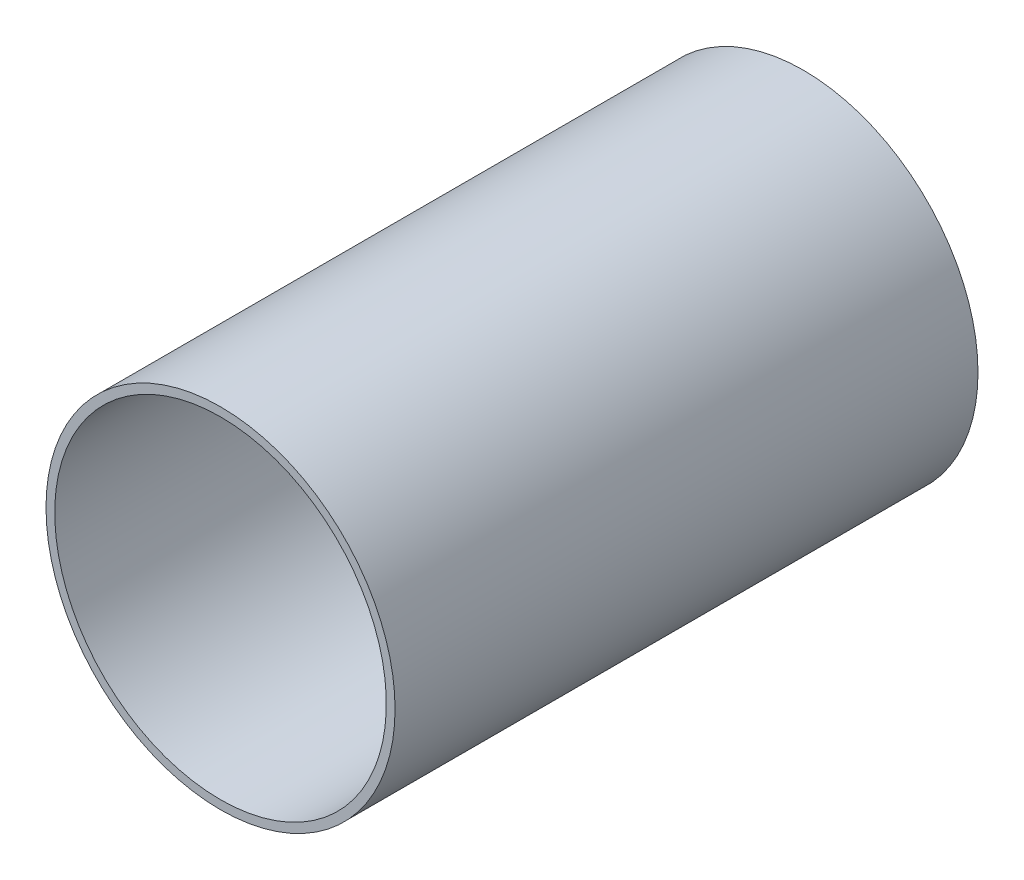
ISO-10303-21;
HEADER;
FILE_DESCRIPTION(('STEP AP214'),'2;1');
FILE_NAME('part.step','',(''),(''),'','','');
FILE_SCHEMA(('AUTOMOTIVE_DESIGN { 1 0 10303 214 1 1 1 1 }'));
ENDSEC;
DATA;
#1=APPLICATION_CONTEXT('core data for automotive mechanical design processes');
#2=APPLICATION_PROTOCOL_DEFINITION('international standard','automotive_design',2000,#1);
#3=PRODUCT_CONTEXT('',#1,'mechanical');
#4=PRODUCT('Part','Part','',(#3));
#5=PRODUCT_RELATED_PRODUCT_CATEGORY('part','',(#4));
#6=PRODUCT_DEFINITION_FORMATION('','',#4);
#7=PRODUCT_DEFINITION_CONTEXT('part definition',#1,'design');
#8=PRODUCT_DEFINITION('design','',#6,#7);
#9=PRODUCT_DEFINITION_SHAPE('','',#8);
#10=(LENGTH_UNIT() NAMED_UNIT(*) SI_UNIT(.MILLI.,.METRE.));
#11=(NAMED_UNIT(*) PLANE_ANGLE_UNIT() SI_UNIT($,.RADIAN.));
#12=(NAMED_UNIT(*) SI_UNIT($,.STERADIAN.) SOLID_ANGLE_UNIT());
#13=UNCERTAINTY_MEASURE_WITH_UNIT(LENGTH_MEASURE(1.E-05),#10,'distance_accuracy_value','');
#14=(GEOMETRIC_REPRESENTATION_CONTEXT(3) GLOBAL_UNCERTAINTY_ASSIGNED_CONTEXT((#13)) GLOBAL_UNIT_ASSIGNED_CONTEXT((#10,
#11,#12)) REPRESENTATION_CONTEXT('',''));
#15=CARTESIAN_POINT('',(0.,0.,0.));
#16=DIRECTION('',(0.,0.,1.));
#17=DIRECTION('',(1.,0.,0.));
#18=AXIS2_PLACEMENT_3D('',#15,#16,#17);
#19=CARTESIAN_POINT('',(164.,-89.01,-0.045));
#20=DIRECTION('',(0.,0.,-1.));
#21=DIRECTION('',(0.,-1.,0.));
#22=AXIS2_PLACEMENT_3D('',#19,#20,#21);
#23=CYLINDRICAL_SURFACE('',#22,0.475);
#24=CARTESIAN_POINT('',(164.,-89.01,-0.035));
#25=DIRECTION('',(0.,0.,-1.));
#26=DIRECTION('',(0.,-1.,0.));
#27=AXIS2_PLACEMENT_3D('',#24,#25,#26);
#28=CIRCLE('',#27,0.475);
#29=CARTESIAN_POINT('',(164.,-89.485,-0.035));
#30=VERTEX_POINT('',#29);
#31=EDGE_CURVE('E64',#30,#30,#28,.T.);
#32=ORIENTED_EDGE('',*,*,#31,.T.);
#33=DIRECTION('',(0.,0.,1.));
#34=VECTOR('',#33,1.);
#35=CARTESIAN_POINT('',(164.,-89.485,-0.045));
#36=LINE('',#35,#34);
#37=CARTESIAN_POINT('',(164.,-89.485,1.635));
#38=VERTEX_POINT('',#37);
#39=EDGE_CURVE('E11',#30,#38,#36,.T.);
#40=ORIENTED_EDGE('',*,*,#39,.T.);
#41=CARTESIAN_POINT('',(164.,-89.01,1.635));
#42=DIRECTION('',(0.,0.,-1.));
#43=DIRECTION('',(0.,-1.,0.));
#44=AXIS2_PLACEMENT_3D('',#41,#42,#43);
#45=CIRCLE('',#44,0.475);
#46=EDGE_CURVE('E25',#38,#38,#45,.T.);
#47=ORIENTED_EDGE('',*,*,#46,.F.);
#48=ORIENTED_EDGE('',*,*,#39,.F.);
#49=EDGE_LOOP('',(#32,#40,#47,#48));
#50=FACE_BOUND('',#49,.T.);
#51=ADVANCED_FACE('F17',(#50),#23,.F.);
#52=CARTESIAN_POINT('',(164.,-89.51,1.635));
#53=DIRECTION('',(0.,0.,1.));
#54=DIRECTION('',(1.,0.,0.));
#55=AXIS2_PLACEMENT_3D('',#52,#53,#54);
#56=PLANE('',#55);
#57=ORIENTED_EDGE('',*,*,#46,.T.);
#58=EDGE_LOOP('',(#57));
#59=FACE_BOUND('',#58,.T.);
#60=CARTESIAN_POINT('',(164.,-89.01,1.635));
#61=DIRECTION('',(0.,0.,1.));
#62=DIRECTION('',(0.,-1.,0.));
#63=AXIS2_PLACEMENT_3D('',#60,#61,#62);
#64=CIRCLE('',#63,0.5);
#65=CARTESIAN_POINT('',(164.,-89.51,1.635));
#66=VERTEX_POINT('',#65);
#67=EDGE_CURVE('E56',#66,#66,#64,.T.);
#68=ORIENTED_EDGE('',*,*,#67,.T.);
#69=EDGE_LOOP('',(#68));
#70=FACE_BOUND('',#69,.T.);
#71=ADVANCED_FACE('F73',(#59,#70),#56,.T.);
#72=CARTESIAN_POINT('',(164.,-89.51,-0.035));
#73=DIRECTION('',(0.,0.,1.));
#74=DIRECTION('',(1.,0.,0.));
#75=AXIS2_PLACEMENT_3D('',#72,#73,#74);
#76=PLANE('',#75);
#77=ORIENTED_EDGE('',*,*,#31,.F.);
#78=EDGE_LOOP('',(#77));
#79=FACE_BOUND('',#78,.T.);
#80=CARTESIAN_POINT('',(164.,-89.01,-0.035));
#81=DIRECTION('',(0.,0.,1.));
#82=DIRECTION('',(0.,-1.,0.));
#83=AXIS2_PLACEMENT_3D('',#80,#81,#82);
#84=CIRCLE('',#83,0.5);
#85=CARTESIAN_POINT('',(164.,-89.51,-0.035));
#86=VERTEX_POINT('',#85);
#87=EDGE_CURVE('E55',#86,#86,#84,.T.);
#88=ORIENTED_EDGE('',*,*,#87,.F.);
#89=EDGE_LOOP('',(#88));
#90=FACE_BOUND('',#89,.T.);
#91=ADVANCED_FACE('F82',(#79,#90),#76,.F.);
#92=CARTESIAN_POINT('',(164.,-89.01,-0.035));
#93=DIRECTION('',(0.,0.,-1.));
#94=DIRECTION('',(0.,-1.,0.));
#95=AXIS2_PLACEMENT_3D('',#92,#93,#94);
#96=CYLINDRICAL_SURFACE('',#95,0.5);
#97=ORIENTED_EDGE('',*,*,#87,.T.);
#98=DIRECTION('',(0.,0.,1.));
#99=VECTOR('',#98,1.);
#100=CARTESIAN_POINT('',(164.,-89.51,-0.035));
#101=LINE('',#100,#99);
#102=EDGE_CURVE('E52',#86,#66,#101,.T.);
#103=ORIENTED_EDGE('',*,*,#102,.T.);
#104=ORIENTED_EDGE('',*,*,#67,.F.);
#105=ORIENTED_EDGE('',*,*,#102,.F.);
#106=EDGE_LOOP('',(#97,#103,#104,#105));
#107=FACE_BOUND('',#106,.T.);
#108=ADVANCED_FACE('F53',(#107),#96,.T.);
#109=CLOSED_SHELL('',(#51,#71,#91,#108));
#110=MANIFOLD_SOLID_BREP('B1',#109);
#111=ADVANCED_BREP_SHAPE_REPRESENTATION('',(#18,#110),#14);
#112=SHAPE_DEFINITION_REPRESENTATION(#9,#111);
ENDSEC;
END-ISO-10303-21;
